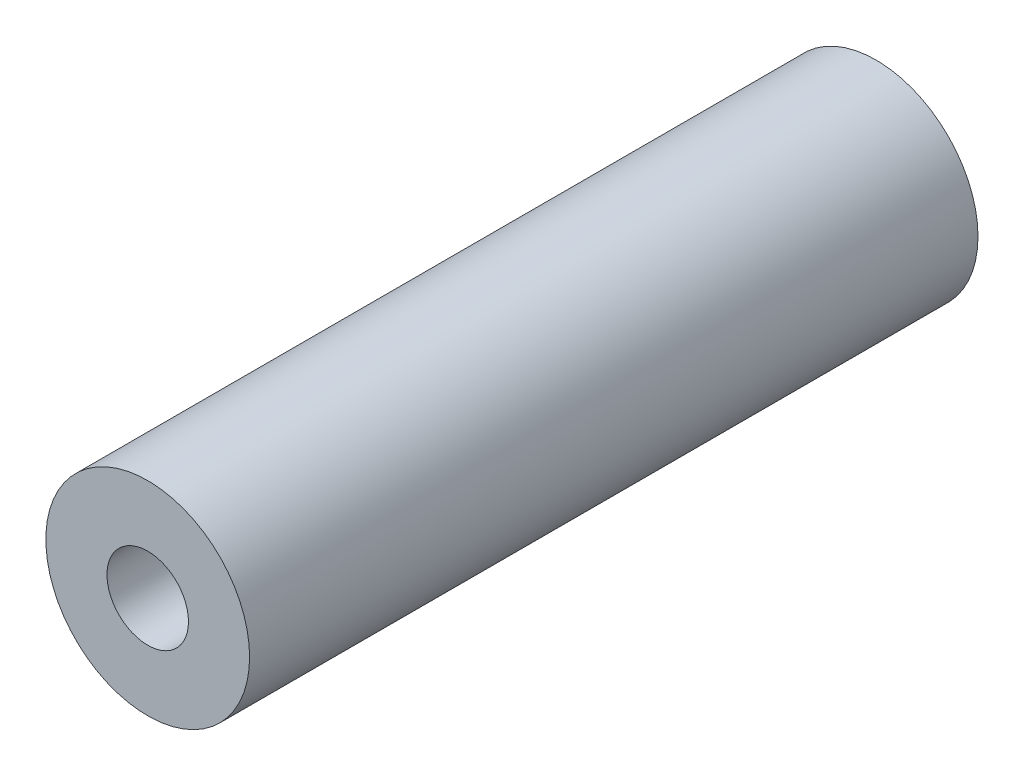
ISO-10303-21;
HEADER;
FILE_DESCRIPTION(('STEP AP214'),'2;1');
FILE_NAME('part.step','',(''),(''),'','','');
FILE_SCHEMA(('AUTOMOTIVE_DESIGN { 1 0 10303 214 1 1 1 1 }'));
ENDSEC;
DATA;
#1=APPLICATION_CONTEXT('core data for automotive mechanical design processes');
#2=APPLICATION_PROTOCOL_DEFINITION('international standard','automotive_design',2000,#1);
#3=PRODUCT_CONTEXT('',#1,'mechanical');
#4=PRODUCT('Part','Part','',(#3));
#5=PRODUCT_RELATED_PRODUCT_CATEGORY('part','',(#4));
#6=PRODUCT_DEFINITION_FORMATION('','',#4);
#7=PRODUCT_DEFINITION_CONTEXT('part definition',#1,'design');
#8=PRODUCT_DEFINITION('design','',#6,#7);
#9=PRODUCT_DEFINITION_SHAPE('','',#8);
#10=(LENGTH_UNIT() NAMED_UNIT(*) SI_UNIT(.MILLI.,.METRE.));
#11=(NAMED_UNIT(*) PLANE_ANGLE_UNIT() SI_UNIT($,.RADIAN.));
#12=(NAMED_UNIT(*) SI_UNIT($,.STERADIAN.) SOLID_ANGLE_UNIT());
#13=UNCERTAINTY_MEASURE_WITH_UNIT(LENGTH_MEASURE(1.E-05),#10,'distance_accuracy_value','');
#14=(GEOMETRIC_REPRESENTATION_CONTEXT(3) GLOBAL_UNCERTAINTY_ASSIGNED_CONTEXT((#13)) GLOBAL_UNIT_ASSIGNED_CONTEXT((#10,
#11,#12)) REPRESENTATION_CONTEXT('',''));
#15=CARTESIAN_POINT('',(0.,0.,0.));
#16=DIRECTION('',(0.,0.,1.));
#17=DIRECTION('',(1.,0.,0.));
#18=AXIS2_PLACEMENT_3D('',#15,#16,#17);
#19=CARTESIAN_POINT('',(0.,0.,28.6));
#20=DIRECTION('',(0.,0.,1.));
#21=DIRECTION('',(1.,0.,0.));
#22=AXIS2_PLACEMENT_3D('',#19,#20,#21);
#23=PLANE('',#22);
#24=CARTESIAN_POINT('',(0.,0.,28.6));
#25=DIRECTION('',(0.,0.,1.));
#26=DIRECTION('',(1.,0.,0.));
#27=AXIS2_PLACEMENT_3D('',#24,#25,#26);
#28=CIRCLE('',#27,4.);
#29=CARTESIAN_POINT('',(4.,0.,28.6));
#30=VERTEX_POINT('',#29);
#31=EDGE_CURVE('E10',#30,#30,#28,.T.);
#32=ORIENTED_EDGE('',*,*,#31,.T.);
#33=EDGE_LOOP('',(#32));
#34=FACE_BOUND('',#33,.T.);
#35=CARTESIAN_POINT('',(0.,0.,28.6));
#36=DIRECTION('',(0.,0.,1.));
#37=DIRECTION('',(1.,0.,0.));
#38=AXIS2_PLACEMENT_3D('',#35,#36,#37);
#39=CIRCLE('',#38,1.6);
#40=CARTESIAN_POINT('',(1.6,0.,28.6));
#41=VERTEX_POINT('',#40);
#42=EDGE_CURVE('E55',#41,#41,#39,.T.);
#43=ORIENTED_EDGE('',*,*,#42,.F.);
#44=EDGE_LOOP('',(#43));
#45=FACE_BOUND('',#44,.T.);
#46=ADVANCED_FACE('F41',(#34,#45),#23,.T.);
#47=CARTESIAN_POINT('',(0.,0.,0.));
#48=DIRECTION('',(0.,0.,1.));
#49=DIRECTION('',(1.,0.,0.));
#50=AXIS2_PLACEMENT_3D('',#47,#48,#49);
#51=PLANE('',#50);
#52=CARTESIAN_POINT('',(0.,0.,0.));
#53=DIRECTION('',(0.,0.,1.));
#54=DIRECTION('',(1.,0.,0.));
#55=AXIS2_PLACEMENT_3D('',#52,#53,#54);
#56=CIRCLE('',#55,4.);
#57=CARTESIAN_POINT('',(4.,0.,0.));
#58=VERTEX_POINT('',#57);
#59=EDGE_CURVE('E44',#58,#58,#56,.T.);
#60=ORIENTED_EDGE('',*,*,#59,.F.);
#61=EDGE_LOOP('',(#60));
#62=FACE_BOUND('',#61,.T.);
#63=CARTESIAN_POINT('',(0.,0.,0.));
#64=DIRECTION('',(0.,0.,1.));
#65=DIRECTION('',(1.,0.,0.));
#66=AXIS2_PLACEMENT_3D('',#63,#64,#65);
#67=CIRCLE('',#66,1.6);
#68=CARTESIAN_POINT('',(1.6,0.,0.));
#69=VERTEX_POINT('',#68);
#70=EDGE_CURVE('E53',#69,#69,#67,.T.);
#71=ORIENTED_EDGE('',*,*,#70,.T.);
#72=EDGE_LOOP('',(#71));
#73=FACE_BOUND('',#72,.T.);
#74=ADVANCED_FACE('F63',(#62,#73),#51,.F.);
#75=CARTESIAN_POINT('',(0.,0.,28.6));
#76=DIRECTION('',(0.,0.,-1.));
#77=DIRECTION('',(-1.,0.,0.));
#78=AXIS2_PLACEMENT_3D('',#75,#76,#77);
#79=CYLINDRICAL_SURFACE('',#78,4.);
#80=ORIENTED_EDGE('',*,*,#31,.F.);
#81=EDGE_LOOP('',(#80));
#82=FACE_BOUND('',#81,.T.);
#83=ORIENTED_EDGE('',*,*,#59,.T.);
#84=EDGE_LOOP('',(#83));
#85=FACE_BOUND('',#84,.T.);
#86=ADVANCED_FACE('F43',(#82,#85),#79,.T.);
#87=CARTESIAN_POINT('',(0.,0.,28.6));
#88=DIRECTION('',(0.,0.,-1.));
#89=DIRECTION('',(-1.,0.,0.));
#90=AXIS2_PLACEMENT_3D('',#87,#88,#89);
#91=CYLINDRICAL_SURFACE('',#90,1.6);
#92=ORIENTED_EDGE('',*,*,#42,.T.);
#93=EDGE_LOOP('',(#92));
#94=FACE_BOUND('',#93,.T.);
#95=ORIENTED_EDGE('',*,*,#70,.F.);
#96=EDGE_LOOP('',(#95));
#97=FACE_BOUND('',#96,.T.);
#98=ADVANCED_FACE('F58',(#94,#97),#91,.F.);
#99=CLOSED_SHELL('',(#46,#74,#86,#98));
#100=MANIFOLD_SOLID_BREP('B2',#99);
#101=ADVANCED_BREP_SHAPE_REPRESENTATION('',(#18,#100),#14);
#102=SHAPE_DEFINITION_REPRESENTATION(#9,#101);
ENDSEC;
END-ISO-10303-21;
